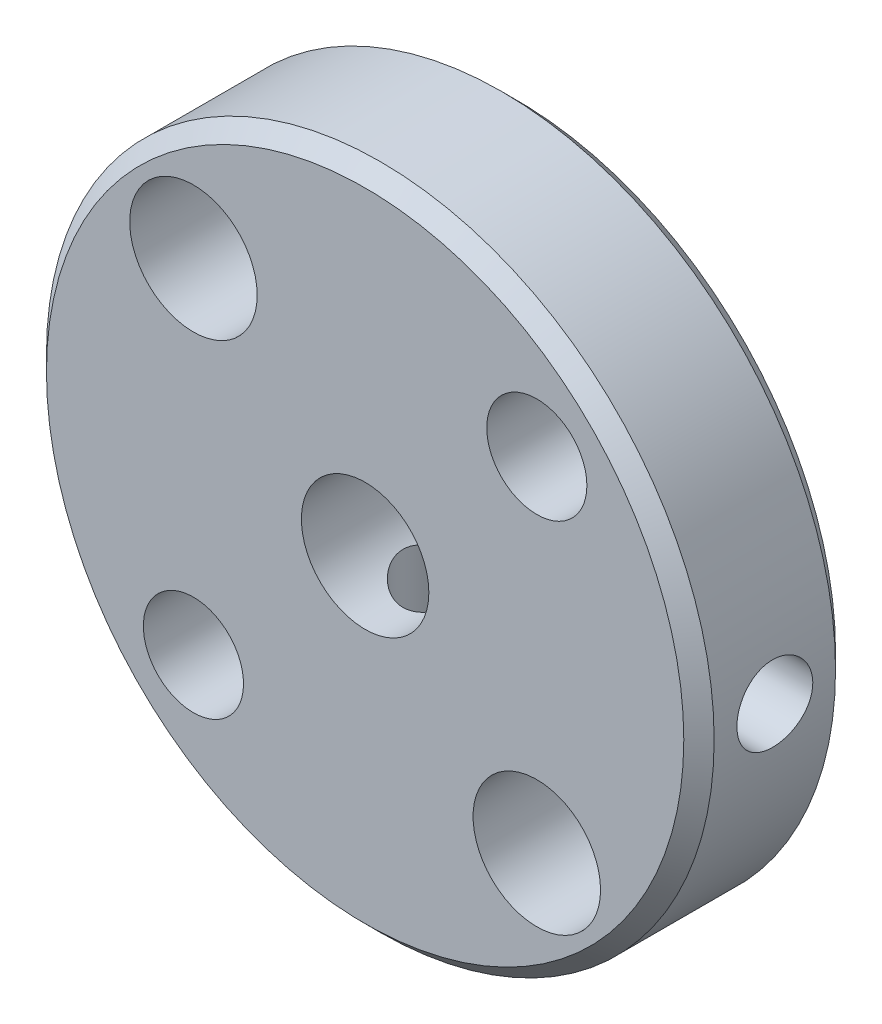
ISO-10303-21;
HEADER;
FILE_DESCRIPTION(('STEP AP214'),'2;1');
FILE_NAME('part.step','',(''),(''),'','','');
FILE_SCHEMA(('AUTOMOTIVE_DESIGN { 1 0 10303 214 1 1 1 1 }'));
ENDSEC;
DATA;
#1=APPLICATION_CONTEXT('core data for automotive mechanical design processes');
#2=APPLICATION_PROTOCOL_DEFINITION('international standard','automotive_design',2000,#1);
#3=PRODUCT_CONTEXT('',#1,'mechanical');
#4=PRODUCT('Part','Part','',(#3));
#5=PRODUCT_RELATED_PRODUCT_CATEGORY('part','',(#4));
#6=PRODUCT_DEFINITION_FORMATION('','',#4);
#7=PRODUCT_DEFINITION_CONTEXT('part definition',#1,'design');
#8=PRODUCT_DEFINITION('design','',#6,#7);
#9=PRODUCT_DEFINITION_SHAPE('','',#8);
#10=(LENGTH_UNIT() NAMED_UNIT(*) SI_UNIT(.MILLI.,.METRE.));
#11=(NAMED_UNIT(*) PLANE_ANGLE_UNIT() SI_UNIT($,.RADIAN.));
#12=(NAMED_UNIT(*) SI_UNIT($,.STERADIAN.) SOLID_ANGLE_UNIT());
#13=UNCERTAINTY_MEASURE_WITH_UNIT(LENGTH_MEASURE(1.E-05),#10,'distance_accuracy_value','');
#14=(GEOMETRIC_REPRESENTATION_CONTEXT(3) GLOBAL_UNCERTAINTY_ASSIGNED_CONTEXT((#13)) GLOBAL_UNIT_ASSIGNED_CONTEXT((#10,
#11,#12)) REPRESENTATION_CONTEXT('',''));
#15=CARTESIAN_POINT('',(0.,0.,0.));
#16=DIRECTION('',(0.,0.,1.));
#17=DIRECTION('',(1.,0.,0.));
#18=AXIS2_PLACEMENT_3D('',#15,#16,#17);
#19=CARTESIAN_POINT('',(0.,0.,4.));
#20=DIRECTION('',(0.,0.,-1.));
#21=DIRECTION('',(-1.,0.,0.));
#22=AXIS2_PLACEMENT_3D('',#19,#20,#21);
#23=CYLINDRICAL_SURFACE('',#22,4.);
#24=CARTESIAN_POINT('',(0.,0.,0.500000000000004));
#25=DIRECTION('',(0.,0.,1.));
#26=DIRECTION('',(1.,0.,0.));
#27=AXIS2_PLACEMENT_3D('',#24,#25,#26);
#28=CIRCLE('',#27,4.);
#29=CARTESIAN_POINT('',(4.,0.,0.500000000000004));
#30=VERTEX_POINT('',#29);
#31=EDGE_CURVE('E39',#30,#30,#28,.T.);
#32=ORIENTED_EDGE('',*,*,#31,.T.);
#33=EDGE_LOOP('',(#32));
#34=FACE_BOUND('',#33,.T.);
#35=CARTESIAN_POINT('',(0.,0.,4.));
#36=DIRECTION('',(0.,0.,1.));
#37=DIRECTION('',(1.,0.,0.));
#38=AXIS2_PLACEMENT_3D('',#35,#36,#37);
#39=CIRCLE('',#38,4.);
#40=CARTESIAN_POINT('',(4.,0.,4.));
#41=VERTEX_POINT('',#40);
#42=EDGE_CURVE('E58',#41,#41,#39,.T.);
#43=ORIENTED_EDGE('',*,*,#42,.F.);
#44=EDGE_LOOP('',(#43));
#45=FACE_BOUND('',#44,.T.);
#46=ADVANCED_FACE('F32',(#34,#45),#23,.T.);
#47=CARTESIAN_POINT('',(0.,0.,0.));
#48=DIRECTION('',(0.,0.,1.));
#49=DIRECTION('',(1.,0.,0.));
#50=AXIS2_PLACEMENT_3D('',#47,#48,#49);
#51=PLANE('',#50);
#52=CARTESIAN_POINT('',(0.,0.,0.));
#53=DIRECTION('',(0.,0.,1.));
#54=DIRECTION('',(1.,0.,0.));
#55=AXIS2_PLACEMENT_3D('',#52,#53,#54);
#56=CIRCLE('',#55,3.5);
#57=CARTESIAN_POINT('',(3.5,0.,0.));
#58=VERTEX_POINT('',#57);
#59=EDGE_CURVE('E10',#58,#58,#56,.F.);
#60=ORIENTED_EDGE('',*,*,#59,.T.);
#61=EDGE_LOOP('',(#60));
#62=FACE_BOUND('',#61,.T.);
#63=CARTESIAN_POINT('',(0.,0.,0.));
#64=DIRECTION('',(0.,0.,1.));
#65=DIRECTION('',(1.,0.,0.));
#66=AXIS2_PLACEMENT_3D('',#63,#64,#65);
#67=CIRCLE('',#66,2.1);
#68=CARTESIAN_POINT('',(2.1,0.,0.));
#69=VERTEX_POINT('',#68);
#70=EDGE_CURVE('E271',#69,#69,#67,.T.);
#71=ORIENTED_EDGE('',*,*,#70,.T.);
#72=EDGE_LOOP('',(#71));
#73=FACE_BOUND('',#72,.T.);
#74=ADVANCED_FACE('F106',(#62,#73),#51,.F.);
#75=CARTESIAN_POINT('',(0.,0.,4.));
#76=DIRECTION('',(0.,0.,1.));
#77=DIRECTION('',(1.,0.,0.));
#78=AXIS2_PLACEMENT_3D('',#75,#76,#77);
#79=PLANE('',#78);
#80=CARTESIAN_POINT('',(0.,0.,4.));
#81=DIRECTION('',(0.,0.,1.));
#82=DIRECTION('',(1.,0.,0.));
#83=AXIS2_PLACEMENT_3D('',#80,#81,#82);
#84=CIRCLE('',#83,10.5);
#85=CARTESIAN_POINT('',(10.5,0.,4.));
#86=VERTEX_POINT('',#85);
#87=EDGE_CURVE('E43',#86,#86,#84,.F.);
#88=ORIENTED_EDGE('',*,*,#87,.T.);
#89=EDGE_LOOP('',(#88));
#90=FACE_BOUND('',#89,.T.);
#91=CARTESIAN_POINT('',(5.65685424949235,5.65685424949241,4.));
#92=DIRECTION('',(0.,0.,1.));
#93=DIRECTION('',(1.,0.,0.));
#94=AXIS2_PLACEMENT_3D('',#91,#92,#93);
#95=CIRCLE('',#94,1.64999999999999);
#96=CARTESIAN_POINT('',(7.30685424949234,5.65685424949241,4.));
#97=VERTEX_POINT('',#96);
#98=EDGE_CURVE('E282',#97,#97,#95,.T.);
#99=ORIENTED_EDGE('',*,*,#98,.T.);
#100=EDGE_LOOP('',(#99));
#101=FACE_BOUND('',#100,.T.);
#102=CARTESIAN_POINT('',(-5.65685424949235,-5.65685424949242,4.));
#103=DIRECTION('',(0.,0.,1.));
#104=DIRECTION('',(1.,0.,0.));
#105=AXIS2_PLACEMENT_3D('',#102,#103,#104);
#106=CIRCLE('',#105,1.64999999999999);
#107=CARTESIAN_POINT('',(-4.00685424949235,-5.65685424949242,4.));
#108=VERTEX_POINT('',#107);
#109=EDGE_CURVE('E275',#108,#108,#106,.T.);
#110=ORIENTED_EDGE('',*,*,#109,.T.);
#111=EDGE_LOOP('',(#110));
#112=FACE_BOUND('',#111,.T.);
#113=CARTESIAN_POINT('',(5.65685424949241,-5.65685424949235,4.));
#114=DIRECTION('',(0.,0.,1.));
#115=DIRECTION('',(1.,0.,0.));
#116=AXIS2_PLACEMENT_3D('',#113,#114,#115);
#117=CIRCLE('',#116,2.1);
#118=CARTESIAN_POINT('',(7.75685424949241,-5.65685424949235,4.));
#119=VERTEX_POINT('',#118);
#120=EDGE_CURVE('E263',#119,#119,#117,.T.);
#121=ORIENTED_EDGE('',*,*,#120,.T.);
#122=EDGE_LOOP('',(#121));
#123=FACE_BOUND('',#122,.T.);
#124=CARTESIAN_POINT('',(-5.65685424949241,5.65685424949235,4.));
#125=DIRECTION('',(0.,0.,1.));
#126=DIRECTION('',(1.,0.,0.));
#127=AXIS2_PLACEMENT_3D('',#124,#125,#126);
#128=CIRCLE('',#127,2.1);
#129=CARTESIAN_POINT('',(-3.55685424949241,5.65685424949235,4.));
#130=VERTEX_POINT('',#129);
#131=EDGE_CURVE('E260',#130,#130,#128,.T.);
#132=ORIENTED_EDGE('',*,*,#131,.T.);
#133=EDGE_LOOP('',(#132));
#134=FACE_BOUND('',#133,.T.);
#135=ORIENTED_EDGE('',*,*,#42,.T.);
#136=EDGE_LOOP('',(#135));
#137=FACE_BOUND('',#136,.T.);
#138=ADVANCED_FACE('F103',(#90,#101,#112,#123,#134,#137),#79,.F.);
#139=CARTESIAN_POINT('',(0.,0.,9.));
#140=DIRECTION('',(0.,0.,-1.));
#141=DIRECTION('',(-1.,0.,0.));
#142=AXIS2_PLACEMENT_3D('',#139,#140,#141);
#143=CYLINDRICAL_SURFACE('',#142,11.);
#144=CARTESIAN_POINT('',(0.,0.,8.5));
#145=DIRECTION('',(0.,0.,1.));
#146=DIRECTION('',(1.,0.,0.));
#147=AXIS2_PLACEMENT_3D('',#144,#145,#146);
#148=CIRCLE('',#147,11.);
#149=CARTESIAN_POINT('',(11.,0.,8.5));
#150=VERTEX_POINT('',#149);
#151=EDGE_CURVE('E47',#150,#150,#148,.F.);
#152=ORIENTED_EDGE('',*,*,#151,.T.);
#153=EDGE_LOOP('',(#152));
#154=FACE_BOUND('',#153,.T.);
#155=CARTESIAN_POINT('',(0.,0.,4.50000000000001));
#156=DIRECTION('',(0.,0.,1.));
#157=DIRECTION('',(1.,0.,0.));
#158=AXIS2_PLACEMENT_3D('',#155,#156,#157);
#159=CIRCLE('',#158,11.);
#160=CARTESIAN_POINT('',(11.,0.,4.50000000000001));
#161=VERTEX_POINT('',#160);
#162=EDGE_CURVE('E52',#161,#161,#159,.T.);
#163=ORIENTED_EDGE('',*,*,#162,.T.);
#164=EDGE_LOOP('',(#163));
#165=FACE_BOUND('',#164,.T.);
#166=CARTESIAN_POINT('',(11.,0.,7.75));
#167=CARTESIAN_POINT('',(10.999999098796,0.0699710602463905,7.74999699818814));
#168=CARTESIAN_POINT('',(10.9993252987046,0.139987069063152,7.74410506509641));
#169=CARTESIAN_POINT('',(10.996702178266,0.278074243505308,7.7206920371657));
#170=CARTESIAN_POINT('',(10.9947514907003,0.346143242753134,7.7031584768452));
#171=CARTESIAN_POINT('',(10.9897945640633,0.478317045301611,7.65698245914168));
#172=CARTESIAN_POINT('',(10.9867890005829,0.542424355017556,7.62834711062706));
#173=CARTESIAN_POINT('',(10.9800574647103,0.664910051163571,7.56079510299002));
#174=CARTESIAN_POINT('',(10.9763316253718,0.72328949268255,7.52188034225789));
#175=CARTESIAN_POINT('',(10.968557071608,0.832943192201809,7.43468294825341));
#176=CARTESIAN_POINT('',(10.9645070990459,0.884187415914031,7.38636265432368));
#177=CARTESIAN_POINT('',(10.9565510031881,0.977857611459238,7.28180649659008));
#178=CARTESIAN_POINT('',(10.9526448868951,1.02028315448394,7.22557024809588));
#179=CARTESIAN_POINT('',(10.9454062056308,1.09522113283396,7.10658651677426));
#180=CARTESIAN_POINT('',(10.9420752550327,1.12770585724163,7.04382147448482));
#181=CARTESIAN_POINT('',(10.9363802408844,1.18166312999786,6.91368303245055));
#182=CARTESIAN_POINT('',(10.9340161468672,1.20313602534935,6.84630977799478));
#183=CARTESIAN_POINT('',(10.9305342775891,1.23436981435038,6.70917683280815));
#184=CARTESIAN_POINT('',(10.9294111476981,1.24418104088523,6.63942874432143));
#185=CARTESIAN_POINT('',(10.928521890078,1.25196865940669,6.49926759216056));
#186=CARTESIAN_POINT('',(10.9287557169125,1.24994544765991,6.42885455083064));
#187=CARTESIAN_POINT('',(10.9305490559729,1.23416301698987,6.2897111909642));
#188=CARTESIAN_POINT('',(10.9321023319257,1.2204590054152,6.22097451875746));
#189=CARTESIAN_POINT('',(10.9363498240334,1.18179000539203,6.08678297309618));
#190=CARTESIAN_POINT('',(10.9390440596154,1.15682482519956,6.02132815554287));
#191=CARTESIAN_POINT('',(10.9452770263127,1.09628205008233,5.89538543961468));
#192=CARTESIAN_POINT('',(10.9488176820281,1.06068022266344,5.83490928933374));
#193=CARTESIAN_POINT('',(10.9563429994385,0.979892129097689,5.72076925155199));
#194=CARTESIAN_POINT('',(10.9603276779232,0.934705500466745,5.66710562181413));
#195=CARTESIAN_POINT('',(10.9683198318057,0.835723376133648,5.56779331897667));
#196=CARTESIAN_POINT('',(10.9723273076041,0.781880249551144,5.52219210498768));
#197=CARTESIAN_POINT('',(10.9798921650149,0.66727820558108,5.44066779872062));
#198=CARTESIAN_POINT('',(10.9834495458722,0.606519276591053,5.40474472267966));
#199=CARTESIAN_POINT('',(10.9897150774973,0.479775541657381,5.34359731749806));
#200=CARTESIAN_POINT('',(10.9924230139116,0.413789421907974,5.318375688256));
#201=CARTESIAN_POINT('',(10.9966825017733,0.278481205096897,5.27938340396215));
#202=CARTESIAN_POINT('',(10.9982340979176,0.209159237088414,5.26561230630247));
#203=CARTESIAN_POINT('',(11.0000003081264,0.0695577812373213,5.24997287847912));
#204=CARTESIAN_POINT('',(11.0002222716223,-0.00071428718994585,5.24803911714425));
#205=CARTESIAN_POINT('',(10.9993239851522,-0.140581487877355,5.25595697581694));
#206=CARTESIAN_POINT('',(10.9982037587135,-0.210176631981711,5.26580838924277));
#207=CARTESIAN_POINT('',(10.994751592849,-0.34652339658548,5.29696262846704));
#208=CARTESIAN_POINT('',(10.9924229265985,-0.413282173840718,5.31823452614039));
#209=CARTESIAN_POINT('',(10.9868148348929,-0.5422843728089,5.37159392721105));
#210=CARTESIAN_POINT('',(10.9835353823457,-0.60452766579224,5.40368173880652));
#211=CARTESIAN_POINT('',(10.9763735736619,-0.723026006046902,5.47792232596807));
#212=CARTESIAN_POINT('',(10.9724886880503,-0.779254179921541,5.52011774715062));
#213=CARTESIAN_POINT('',(10.9645592695384,-0.883853426159737,5.61331505860913));
#214=CARTESIAN_POINT('',(10.9605147314369,-0.932224242281398,5.66431723597664));
#215=CARTESIAN_POINT('',(10.9526994422005,-1.01996547066722,5.77396722356543));
#216=CARTESIAN_POINT('',(10.9489300605485,-1.05929271449868,5.83264968850057));
#217=CARTESIAN_POINT('',(10.942113624429,-1.12753292733445,5.95582498686534));
#218=CARTESIAN_POINT('',(10.9390665576492,-1.15644607385566,6.0203177212307));
#219=CARTESIAN_POINT('',(10.9340487479586,-1.20296631338926,6.15313935058659));
#220=CARTESIAN_POINT('',(10.9320756279092,-1.22059839191761,6.22145940091597));
#221=CARTESIAN_POINT('',(10.9294220488897,-1.24413675347566,6.36011418608627));
#222=CARTESIAN_POINT('',(10.9287415409866,-1.25004348037979,6.43044884456001));
#223=CARTESIAN_POINT('',(10.9287514804399,-1.24995628412513,6.57070705786577));
#224=CARTESIAN_POINT('',(10.9294341158956,-1.24403017260146,6.64063066519323));
#225=CARTESIAN_POINT('',(10.9320766991578,-1.22058843708503,6.77848162141657));
#226=CARTESIAN_POINT('',(10.9340366477847,-1.20307280564941,6.84640896903041));
#227=CARTESIAN_POINT('',(10.9390107260672,-1.15696926667391,6.9783342740526));
#228=CARTESIAN_POINT('',(10.9420246021864,-1.12838402190135,7.0423331721536));
#229=CARTESIAN_POINT('',(10.9487674156768,-1.06095945000957,7.16463624005349));
#230=CARTESIAN_POINT('',(10.9524963558113,-1.02212008326356,7.22294038784396));
#231=CARTESIAN_POINT('',(10.9602747641055,-0.935036488100206,7.33254612900023));
#232=CARTESIAN_POINT('',(10.96432588332,-0.886741677283562,7.3838074186029));
#233=CARTESIAN_POINT('',(10.972277338952,-0.782221793226697,7.47752568809066));
#234=CARTESIAN_POINT('',(10.9761776393339,-0.725994839471947,7.51998057428255));
#235=CARTESIAN_POINT('',(10.9834013412845,-0.607005915440242,7.59499201372946));
#236=CARTESIAN_POINT('',(10.9867228740683,-0.54422378573771,7.62751674875123));
#237=CARTESIAN_POINT('',(10.9923953332668,-0.414088724759976,7.68151706433772));
#238=CARTESIAN_POINT('',(10.9947473329669,-0.346740944451953,7.70300486944508));
#239=CARTESIAN_POINT('',(10.9976371163841,-0.23252369968437,7.7290739614261));
#240=CARTESIAN_POINT('',(10.9985189706332,-0.186379504843341,7.73691021850484));
#241=CARTESIAN_POINT('',(10.9997007118951,-0.09349689521114,7.74737422589619));
#242=CARTESIAN_POINT('',(11.0000006022337,-0.046758483817382,7.75000200597462));
#243=CARTESIAN_POINT('',(11.,0.,7.75));
#244=B_SPLINE_CURVE_WITH_KNOTS('',3,(#166,#167,#168,#169,#170,#171,#172,#173,#174,#175,#176,
#177,#178,#179,#180,#181,#182,#183,#184,#185,#186,#187,#188,#189,#190,#191,#192,#193,#194,#195,
#196,#197,#198,#199,#200,#201,#202,#203,#204,#205,#206,#207,#208,#209,#210,#211,#212,#213,#214,
#215,#216,#217,#218,#219,#220,#221,#222,#223,#224,#225,#226,#227,#228,#229,#230,#231,#232,#233,
#234,#235,#236,#237,#238,#239,#240,#241,#242,#243),.UNSPECIFIED.,.T.,.F.,(4,2,2,2,2,2,2,2,2,2,2,
2,2,2,2,2,2,2,2,2,2,2,2,2,2,2,2,2,2,2,2,2,2,2,2,2,2,2,4),(0.,0.209742411074567,
0.419709770574088,0.629542902006037,0.839337308750923,1.04998970573655,1.26065234329855,
1.47189698188367,1.68313496335365,1.89345787180112,2.10377373779623,2.31310105799441,
2.52243194254448,2.73224341085967,2.94206281537296,3.15307892807649,3.36409539480162,
3.57516506786321,3.78622658187585,3.99612038686368,4.20601051268755,4.41533507552064,
4.62466560353621,4.83489538837651,5.04513202779438,5.25635228791534,5.4675689474421,
5.67831616606275,5.88905540649307,6.09859040856626,6.30812554520447,6.51761030997687,
6.72709588430993,6.9377343421937,7.14842282141904,7.35977947100788,7.57090151365798,
7.71106364850653,7.85122498234265),.UNSPECIFIED.);
#245=CARTESIAN_POINT('',(11.,0.,7.75));
#246=VERTEX_POINT('',#245);
#247=EDGE_CURVE('E67',#246,#246,#244,.T.);
#248=ORIENTED_EDGE('',*,*,#247,.T.);
#249=EDGE_LOOP('',(#248));
#250=FACE_BOUND('',#249,.T.);
#251=CARTESIAN_POINT('',(0.,-11.,7.75));
#252=CARTESIAN_POINT('',(0.069971060246352,-10.999999098796,7.74999699818814));
#253=CARTESIAN_POINT('',(0.139987069063114,-10.9993252987046,7.74410506509641));
#254=CARTESIAN_POINT('',(0.27807424350527,-10.996702178266,7.7206920371657));
#255=CARTESIAN_POINT('',(0.346143242753095,-10.9947514907003,7.7031584768452));
#256=CARTESIAN_POINT('',(0.478317045301572,-10.9897945640633,7.65698245914168));
#257=CARTESIAN_POINT('',(0.542424355017518,-10.9867890005829,7.62834711062706));
#258=CARTESIAN_POINT('',(0.664910051163533,-10.9800574647103,7.56079510299002));
#259=CARTESIAN_POINT('',(0.723289492682511,-10.9763316253718,7.52188034225789));
#260=CARTESIAN_POINT('',(0.832943192201771,-10.968557071608,7.43468294825341));
#261=CARTESIAN_POINT('',(0.884187415913993,-10.9645070990459,7.38636265432368));
#262=CARTESIAN_POINT('',(0.9778576114592,-10.9565510031881,7.28180649659008));
#263=CARTESIAN_POINT('',(1.0202831544839,-10.9526448868951,7.22557024809588));
#264=CARTESIAN_POINT('',(1.09522113283393,-10.9454062056308,7.10658651677426));
#265=CARTESIAN_POINT('',(1.12770585724159,-10.9420752550327,7.04382147448482));
#266=CARTESIAN_POINT('',(1.18166312999782,-10.9363802408844,6.91368303245055));
#267=CARTESIAN_POINT('',(1.20313602534931,-10.9340161468672,6.84630977799478));
#268=CARTESIAN_POINT('',(1.23436981435034,-10.9305342775891,6.70917683280815));
#269=CARTESIAN_POINT('',(1.24418104088519,-10.9294111476981,6.63942874432143));
#270=CARTESIAN_POINT('',(1.25196865940665,-10.928521890078,6.49926759216056));
#271=CARTESIAN_POINT('',(1.24994544765987,-10.9287557169125,6.42885455083064));
#272=CARTESIAN_POINT('',(1.23416301698983,-10.9305490559729,6.2897111909642));
#273=CARTESIAN_POINT('',(1.22045900541516,-10.9321023319257,6.22097451875746));
#274=CARTESIAN_POINT('',(1.18179000539199,-10.9363498240334,6.08678297309618));
#275=CARTESIAN_POINT('',(1.15682482519952,-10.9390440596154,6.02132815554287));
#276=CARTESIAN_POINT('',(1.09628205008229,-10.9452770263127,5.89538543961468));
#277=CARTESIAN_POINT('',(1.0606802226634,-10.9488176820281,5.83490928933374));
#278=CARTESIAN_POINT('',(0.97989212909765,-10.9563429994385,5.72076925155199));
#279=CARTESIAN_POINT('',(0.934705500466707,-10.9603276779232,5.66710562181413));
#280=CARTESIAN_POINT('',(0.83572337613361,-10.9683198318057,5.56779331897667));
#281=CARTESIAN_POINT('',(0.781880249551105,-10.9723273076041,5.52219210498768));
#282=CARTESIAN_POINT('',(0.667278205581041,-10.9798921650149,5.44066779872062));
#283=CARTESIAN_POINT('',(0.606519276591015,-10.9834495458722,5.40474472267966));
#284=CARTESIAN_POINT('',(0.479775541657342,-10.9897150774974,5.34359731749806));
#285=CARTESIAN_POINT('',(0.413789421907936,-10.9924230139116,5.318375688256));
#286=CARTESIAN_POINT('',(0.278481205096859,-10.9966825017733,5.27938340396215));
#287=CARTESIAN_POINT('',(0.209159237088376,-10.9982340979176,5.26561230630247));
#288=CARTESIAN_POINT('',(0.0695577812372829,-11.0000003081264,5.24997287847912));
#289=CARTESIAN_POINT('',(-0.000714287189984217,-11.0002222716223,5.24803911714425));
#290=CARTESIAN_POINT('',(-0.140581487877393,-10.9993239851522,5.25595697581694));
#291=CARTESIAN_POINT('',(-0.210176631981749,-10.9982037587135,5.26580838924277));
#292=CARTESIAN_POINT('',(-0.346523396585519,-10.994751592849,5.29696262846704));
#293=CARTESIAN_POINT('',(-0.413282173840756,-10.9924229265985,5.31823452614039));
#294=CARTESIAN_POINT('',(-0.542284372808938,-10.9868148348929,5.37159392721105));
#295=CARTESIAN_POINT('',(-0.604527665792279,-10.9835353823457,5.40368173880652));
#296=CARTESIAN_POINT('',(-0.723026006046941,-10.9763735736619,5.47792232596807));
#297=CARTESIAN_POINT('',(-0.77925417992158,-10.9724886880503,5.52011774715062));
#298=CARTESIAN_POINT('',(-0.883853426159775,-10.9645592695384,5.61331505860913));
#299=CARTESIAN_POINT('',(-0.932224242281437,-10.9605147314369,5.66431723597664));
#300=CARTESIAN_POINT('',(-1.01996547066726,-10.9526994422005,5.77396722356543));
#301=CARTESIAN_POINT('',(-1.05929271449872,-10.9489300605485,5.83264968850057));
#302=CARTESIAN_POINT('',(-1.12753292733449,-10.942113624429,5.95582498686534));
#303=CARTESIAN_POINT('',(-1.1564460738557,-10.9390665576492,6.0203177212307));
#304=CARTESIAN_POINT('',(-1.20296631338929,-10.9340487479586,6.15313935058659));
#305=CARTESIAN_POINT('',(-1.22059839191765,-10.9320756279092,6.22145940091597));
#306=CARTESIAN_POINT('',(-1.24413675347569,-10.9294220488897,6.36011418608627));
#307=CARTESIAN_POINT('',(-1.25004348037983,-10.9287415409866,6.43044884456001));
#308=CARTESIAN_POINT('',(-1.24995628412517,-10.9287514804399,6.57070705786577));
#309=CARTESIAN_POINT('',(-1.2440301726015,-10.9294341158956,6.64063066519323));
#310=CARTESIAN_POINT('',(-1.22058843708507,-10.9320766991578,6.77848162141657));
#311=CARTESIAN_POINT('',(-1.20307280564944,-10.9340366477846,6.84640896903041));
#312=CARTESIAN_POINT('',(-1.15696926667395,-10.9390107260672,6.9783342740526));
#313=CARTESIAN_POINT('',(-1.12838402190138,-10.9420246021864,7.0423331721536));
#314=CARTESIAN_POINT('',(-1.06095945000961,-10.9487674156768,7.16463624005349));
#315=CARTESIAN_POINT('',(-1.0221200832636,-10.9524963558113,7.22294038784396));
#316=CARTESIAN_POINT('',(-0.935036488100244,-10.9602747641055,7.33254612900023));
#317=CARTESIAN_POINT('',(-0.886741677283601,-10.96432588332,7.3838074186029));
#318=CARTESIAN_POINT('',(-0.782221793226735,-10.972277338952,7.47752568809066));
#319=CARTESIAN_POINT('',(-0.725994839471985,-10.9761776393339,7.51998057428255));
#320=CARTESIAN_POINT('',(-0.60700591544028,-10.9834013412845,7.59499201372946));
#321=CARTESIAN_POINT('',(-0.544223785737749,-10.9867228740683,7.62751674875123));
#322=CARTESIAN_POINT('',(-0.414088724760015,-10.9923953332668,7.68151706433772));
#323=CARTESIAN_POINT('',(-0.346740944451991,-10.9947473329669,7.70300486944508));
#324=CARTESIAN_POINT('',(-0.232523699684408,-10.9976371163841,7.7290739614261));
#325=CARTESIAN_POINT('',(-0.186379504843379,-10.9985189706332,7.73691021850484));
#326=CARTESIAN_POINT('',(-0.0934968952111784,-10.9997007118951,7.74737422589619));
#327=CARTESIAN_POINT('',(-0.0467584838174204,-11.0000006022337,7.75000200597462));
#328=CARTESIAN_POINT('',(0.,-11.,7.75));
#329=B_SPLINE_CURVE_WITH_KNOTS('',3,(#251,#252,#253,#254,#255,#256,#257,#258,#259,#260,#261,
#262,#263,#264,#265,#266,#267,#268,#269,#270,#271,#272,#273,#274,#275,#276,#277,#278,#279,#280,
#281,#282,#283,#284,#285,#286,#287,#288,#289,#290,#291,#292,#293,#294,#295,#296,#297,#298,#299,
#300,#301,#302,#303,#304,#305,#306,#307,#308,#309,#310,#311,#312,#313,#314,#315,#316,#317,#318,
#319,#320,#321,#322,#323,#324,#325,#326,#327,#328),.UNSPECIFIED.,.T.,.F.,(4,2,2,2,2,2,2,2,2,2,2,
2,2,2,2,2,2,2,2,2,2,2,2,2,2,2,2,2,2,2,2,2,2,2,2,2,2,2,4),(0.,0.209742411074567,
0.419709770574088,0.629542902006037,0.839337308750923,1.04998970573655,1.26065234329855,
1.47189698188367,1.68313496335365,1.89345787180112,2.10377373779623,2.31310105799441,
2.52243194254448,2.73224341085967,2.94206281537296,3.15307892807649,3.36409539480162,
3.57516506786321,3.78622658187585,3.99612038686368,4.20601051268755,4.41533507552064,
4.62466560353621,4.83489538837651,5.04513202779438,5.25635228791534,5.4675689474421,
5.67831616606275,5.88905540649307,6.09859040856626,6.30812554520447,6.51761030997687,
6.72709588430993,6.9377343421937,7.14842282141904,7.35977947100788,7.57090151365798,
7.71106364850653,7.85122498234265),.UNSPECIFIED.);
#330=CARTESIAN_POINT('',(0.,-11.,7.75));
#331=VERTEX_POINT('',#330);
#332=EDGE_CURVE('E66',#331,#331,#329,.T.);
#333=ORIENTED_EDGE('',*,*,#332,.T.);
#334=EDGE_LOOP('',(#333));
#335=FACE_BOUND('',#334,.T.);
#336=ADVANCED_FACE('F97',(#154,#165,#250,#335),#143,.T.);
#337=CARTESIAN_POINT('',(0.,0.,9.));
#338=DIRECTION('',(0.,0.,1.));
#339=DIRECTION('',(1.,0.,0.));
#340=AXIS2_PLACEMENT_3D('',#337,#338,#339);
#341=PLANE('',#340);
#342=CARTESIAN_POINT('',(0.,0.,9.));
#343=DIRECTION('',(0.,0.,1.));
#344=DIRECTION('',(1.,0.,0.));
#345=AXIS2_PLACEMENT_3D('',#342,#343,#344);
#346=CIRCLE('',#345,10.5);
#347=CARTESIAN_POINT('',(10.5,0.,9.));
#348=VERTEX_POINT('',#347);
#349=EDGE_CURVE('E55',#348,#348,#346,.T.);
#350=ORIENTED_EDGE('',*,*,#349,.T.);
#351=EDGE_LOOP('',(#350));
#352=FACE_BOUND('',#351,.T.);
#353=CARTESIAN_POINT('',(5.65685424949235,5.65685424949241,9.));
#354=DIRECTION('',(0.,0.,1.));
#355=DIRECTION('',(1.,0.,0.));
#356=AXIS2_PLACEMENT_3D('',#353,#354,#355);
#357=CIRCLE('',#356,1.64999999999999);
#358=CARTESIAN_POINT('',(7.30685424949234,5.65685424949241,9.));
#359=VERTEX_POINT('',#358);
#360=EDGE_CURVE('E91',#359,#359,#357,.T.);
#361=ORIENTED_EDGE('',*,*,#360,.F.);
#362=EDGE_LOOP('',(#361));
#363=FACE_BOUND('',#362,.T.);
#364=CARTESIAN_POINT('',(-5.65685424949235,-5.65685424949242,9.));
#365=DIRECTION('',(0.,0.,1.));
#366=DIRECTION('',(1.,0.,0.));
#367=AXIS2_PLACEMENT_3D('',#364,#365,#366);
#368=CIRCLE('',#367,1.64999999999999);
#369=CARTESIAN_POINT('',(-4.00685424949236,-5.65685424949242,9.));
#370=VERTEX_POINT('',#369);
#371=EDGE_CURVE('E280',#370,#370,#368,.T.);
#372=ORIENTED_EDGE('',*,*,#371,.F.);
#373=EDGE_LOOP('',(#372));
#374=FACE_BOUND('',#373,.T.);
#375=CARTESIAN_POINT('',(0.,0.,9.));
#376=DIRECTION('',(0.,0.,1.));
#377=DIRECTION('',(1.,0.,0.));
#378=AXIS2_PLACEMENT_3D('',#375,#376,#377);
#379=CIRCLE('',#378,2.1);
#380=CARTESIAN_POINT('',(2.1,0.,9.));
#381=VERTEX_POINT('',#380);
#382=EDGE_CURVE('E272',#381,#381,#379,.T.);
#383=ORIENTED_EDGE('',*,*,#382,.F.);
#384=EDGE_LOOP('',(#383));
#385=FACE_BOUND('',#384,.T.);
#386=CARTESIAN_POINT('',(5.65685424949241,-5.65685424949235,9.));
#387=DIRECTION('',(0.,0.,1.));
#388=DIRECTION('',(1.,0.,0.));
#389=AXIS2_PLACEMENT_3D('',#386,#387,#388);
#390=CIRCLE('',#389,2.1);
#391=CARTESIAN_POINT('',(7.75685424949241,-5.65685424949235,9.));
#392=VERTEX_POINT('',#391);
#393=EDGE_CURVE('E268',#392,#392,#390,.T.);
#394=ORIENTED_EDGE('',*,*,#393,.F.);
#395=EDGE_LOOP('',(#394));
#396=FACE_BOUND('',#395,.T.);
#397=CARTESIAN_POINT('',(-5.65685424949241,5.65685424949235,9.));
#398=DIRECTION('',(0.,0.,1.));
#399=DIRECTION('',(1.,0.,0.));
#400=AXIS2_PLACEMENT_3D('',#397,#398,#399);
#401=CIRCLE('',#400,2.1);
#402=CARTESIAN_POINT('',(-3.55685424949241,5.65685424949235,9.));
#403=VERTEX_POINT('',#402);
#404=EDGE_CURVE('E257',#403,#403,#401,.T.);
#405=ORIENTED_EDGE('',*,*,#404,.F.);
#406=EDGE_LOOP('',(#405));
#407=FACE_BOUND('',#406,.T.);
#408=ADVANCED_FACE('F102',(#352,#363,#374,#385,#396,#407),#341,.T.);
#409=CARTESIAN_POINT('',(-5.65685424949241,5.65685424949235,0.));
#410=DIRECTION('',(0.,0.,1.));
#411=DIRECTION('',(1.,0.,0.));
#412=AXIS2_PLACEMENT_3D('',#409,#410,#411);
#413=CYLINDRICAL_SURFACE('',#412,2.1);
#414=ORIENTED_EDGE('',*,*,#404,.T.);
#415=EDGE_LOOP('',(#414));
#416=FACE_BOUND('',#415,.T.);
#417=ORIENTED_EDGE('',*,*,#131,.F.);
#418=EDGE_LOOP('',(#417));
#419=FACE_BOUND('',#418,.T.);
#420=ADVANCED_FACE('F172',(#416,#419),#413,.F.);
#421=CARTESIAN_POINT('',(5.65685424949241,-5.65685424949235,0.));
#422=DIRECTION('',(0.,0.,1.));
#423=DIRECTION('',(1.,0.,0.));
#424=AXIS2_PLACEMENT_3D('',#421,#422,#423);
#425=CYLINDRICAL_SURFACE('',#424,2.1);
#426=ORIENTED_EDGE('',*,*,#393,.T.);
#427=EDGE_LOOP('',(#426));
#428=FACE_BOUND('',#427,.T.);
#429=ORIENTED_EDGE('',*,*,#120,.F.);
#430=EDGE_LOOP('',(#429));
#431=FACE_BOUND('',#430,.T.);
#432=ADVANCED_FACE('F214',(#428,#431),#425,.F.);
#433=CARTESIAN_POINT('',(0.,0.,0.));
#434=DIRECTION('',(0.,0.,1.));
#435=DIRECTION('',(1.,0.,0.));
#436=AXIS2_PLACEMENT_3D('',#433,#434,#435);
#437=CYLINDRICAL_SURFACE('',#436,2.1);
#438=CARTESIAN_POINT('',(2.1,0.,7.75));
#439=CARTESIAN_POINT('',(2.0999971621291,-0.0640226775460139,7.74999688604095));
#440=CARTESIAN_POINT('',(2.09704010748215,-0.128152585956528,7.74504670673764));
#441=CARTESIAN_POINT('',(2.08549318076383,-0.254490052465569,7.72549669407343));
#442=CARTESIAN_POINT('',(2.07688886081917,-0.316692250134415,7.71087210910711));
#443=CARTESIAN_POINT('',(2.05491948806018,-0.437071541174805,7.67278899216858));
#444=CARTESIAN_POINT('',(2.04157803425589,-0.495266909771818,7.64937421779307));
#445=CARTESIAN_POINT('',(2.01127508514269,-0.606722922250688,7.59464414389886));
#446=CARTESIAN_POINT('',(1.99431458574446,-0.659984917956784,7.56333101746527));
#447=CARTESIAN_POINT('',(1.95669521688118,-0.764633596048423,7.4910505974036));
#448=CARTESIAN_POINT('',(1.93585346459021,-0.815572146928477,7.44953145232071));
#449=CARTESIAN_POINT('',(1.89320764923087,-0.910200434935883,7.35925516030214));
#450=CARTESIAN_POINT('',(1.87140238962514,-0.953880818837079,7.3104888251701));
#451=CARTESIAN_POINT('',(1.82618251379142,-1.03807660067335,7.20019581401617));
#452=CARTESIAN_POINT('',(1.80288962715745,-1.07757997860756,7.13783988565906));
#453=CARTESIAN_POINT('',(1.76058953983857,-1.14539465089145,7.00600619630544));
#454=CARTESIAN_POINT('',(1.74157547020439,-1.17372393928512,6.93654011417754));
#455=CARTESIAN_POINT('',(1.71473066078549,-1.21248373271032,6.8093388305415));
#456=CARTESIAN_POINT('',(1.70531511442093,-1.22556989258969,6.75274858985345));
#457=CARTESIAN_POINT('',(1.69210107261266,-1.24375455742579,6.63768294266833));
#458=CARTESIAN_POINT('',(1.68829576397353,-1.24886275144711,6.57920991104747));
#459=CARTESIAN_POINT('',(1.68686250841609,-1.25079855338486,6.46194071082016));
#460=CARTESIAN_POINT('',(1.68924600163593,-1.24761082608098,6.40314414455156));
#461=CARTESIAN_POINT('',(1.69984796582053,-1.2331233542355,6.28708507933644));
#462=CARTESIAN_POINT('',(1.70807076540284,-1.22181759180895,6.22982375114378));
#463=CARTESIAN_POINT('',(1.72910246193482,-1.19186017575499,6.11890060925126));
#464=CARTESIAN_POINT('',(1.74185873198025,-1.1732925825183,6.0652055517297));
#465=CARTESIAN_POINT('',(1.77057784152447,-1.12948602608814,5.96154695520805));
#466=CARTESIAN_POINT('',(1.78654186476551,-1.10424459899153,5.91158480310938));
#467=CARTESIAN_POINT('',(1.8232062705075,-1.04278816280288,5.80765672155948));
#468=CARTESIAN_POINT('',(1.84424868470571,-1.00543141633341,5.7544861537548));
#469=CARTESIAN_POINT('',(1.88682783482907,-0.923057115288971,5.65462353206541));
#470=CARTESIAN_POINT('',(1.90836501880793,-0.878032359435053,5.60793764367753));
#471=CARTESIAN_POINT('',(1.95293116109967,-0.774372380969878,5.51599353269503));
#472=CARTESIAN_POINT('',(1.97576967296533,-0.714720551206721,5.47177669012787));
#473=CARTESIAN_POINT('',(2.01726996029285,-0.58744476042849,5.39412736253287));
#474=CARTESIAN_POINT('',(2.03593405287387,-0.519825254065012,5.36068889012186));
#475=CARTESIAN_POINT('',(2.06590582105561,-0.382910433337661,5.30798262291892));
#476=CARTESIAN_POINT('',(2.0776096407174,-0.314003059026024,5.28794132114503));
#477=CARTESIAN_POINT('',(2.09406064688739,-0.172994947727028,5.25995081492141));
#478=CARTESIAN_POINT('',(2.09881591181968,-0.100898019608298,5.25198756805544));
#479=CARTESIAN_POINT('',(2.10066187521826,0.0340010594324126,5.24888957485223));
#480=CARTESIAN_POINT('',(2.09869010708976,0.0967605901060309,5.25218571429739));
#481=CARTESIAN_POINT('',(2.0892971447952,0.220670943201993,5.26804872787285));
#482=CARTESIAN_POINT('',(2.0818760212691,0.281821786467097,5.28061548182824));
#483=CARTESIAN_POINT('',(2.06248590052885,0.399548676454902,5.31402884821051));
#484=CARTESIAN_POINT('',(2.05061940361192,0.456195325667365,5.33468929586215));
#485=CARTESIAN_POINT('',(2.02328795280575,0.565214901961366,5.38348662059433));
#486=CARTESIAN_POINT('',(2.00782226531477,0.6175869548338,5.4116250220282));
#487=CARTESIAN_POINT('',(1.97266903715224,0.722457373172464,5.47784919994779));
#488=CARTESIAN_POINT('',(1.95270968430037,0.774402244062648,5.51666522501221));
#489=CARTESIAN_POINT('',(1.91138294059351,0.871437420579431,5.60152399500534));
#490=CARTESIAN_POINT('',(1.89001392465818,0.916519609641957,5.64757516826184));
#491=CARTESIAN_POINT('',(1.84494563049028,1.00444659551977,5.75243845312637));
#492=CARTESIAN_POINT('',(1.8212959596932,1.04627618436864,5.81212874580764));
#493=CARTESIAN_POINT('',(1.77734140104422,1.11932053409307,5.93879524249638));
#494=CARTESIAN_POINT('',(1.75703281293633,1.1505470792169,6.00576324799749));
#495=CARTESIAN_POINT('',(1.72661507782045,1.19556431362433,6.13051221645744));
#496=CARTESIAN_POINT('',(1.71525017371525,1.21166478294704,6.18715041099507));
#497=CARTESIAN_POINT('',(1.69796630634197,1.23577331547184,6.30290176900339));
#498=CARTESIAN_POINT('',(1.69204000865982,1.24379227869637,6.36201148653542));
#499=CARTESIAN_POINT('',(1.68650352972723,1.25129160369951,6.48128353714004));
#500=CARTESIAN_POINT('',(1.68691504048417,1.25074264050423,6.54144878098638));
#501=CARTESIAN_POINT('',(1.69404215872104,1.24106963437793,6.66071845364892));
#502=CARTESIAN_POINT('',(1.70076134401336,1.23194072476265,6.71982226100972));
#503=CARTESIAN_POINT('',(1.71909460020772,1.20621151721752,6.8328254604925));
#504=CARTESIAN_POINT('',(1.73048807264549,1.18994589011906,6.88683929782776));
#505=CARTESIAN_POINT('',(1.75682627473565,1.15070330311898,6.99143250347804));
#506=CARTESIAN_POINT('',(1.77177233650402,1.12772382497916,7.0420105743129));
#507=CARTESIAN_POINT('',(1.80633627608319,1.07163065871196,7.14664933877111));
#508=CARTESIAN_POINT('',(1.82631917037502,1.03750044859815,7.20004353206803));
#509=CARTESIAN_POINT('',(1.86729082710308,0.961810730750848,7.30087445880068));
#510=CARTESIAN_POINT('',(1.88828040006965,0.920245160345243,7.34830627646634));
#511=CARTESIAN_POINT('',(1.93277497696981,0.823198229533284,7.4434810767948));
#512=CARTESIAN_POINT('',(1.9561591024339,0.766556979818712,7.49010939052115));
#513=CARTESIAN_POINT('',(1.99952280164544,0.645031020347071,7.57324208542061));
#514=CARTESIAN_POINT('',(2.01950129069582,0.580143695653745,7.60974324340349));
#515=CARTESIAN_POINT('',(2.05319694878141,0.446080134934905,7.66992159869308));
#516=CARTESIAN_POINT('',(2.06711263703509,0.377140547150748,7.69401104733383));
#517=CARTESIAN_POINT('',(2.08800134577756,0.235254827997588,7.72982313958579));
#518=CARTESIAN_POINT('',(2.09500075428707,0.162325054106684,7.7415927977793));
#519=CARTESIAN_POINT('',(2.09874418454867,0.0741347523455937,7.74788882119468));
#520=CARTESIAN_POINT('',(2.09921430803036,0.059324626022796,7.74867961890099));
#521=CARTESIAN_POINT('',(2.0998425488409,0.0296782545394262,7.74973557622602));
#522=CARTESIAN_POINT('',(2.10000065788727,0.0148420086959691,7.7500007218912));
#523=CARTESIAN_POINT('',(2.1,0.,7.75));
#524=B_SPLINE_CURVE_WITH_KNOTS('',3,(#438,#439,#440,#441,#442,#443,#444,#445,#446,#447,#448,
#449,#450,#451,#452,#453,#454,#455,#456,#457,#458,#459,#460,#461,#462,#463,#464,#465,#466,#467,
#468,#469,#470,#471,#472,#473,#474,#475,#476,#477,#478,#479,#480,#481,#482,#483,#484,#485,#486,
#487,#488,#489,#490,#491,#492,#493,#494,#495,#496,#497,#498,#499,#500,#501,#502,#503,#504,#505,
#506,#507,#508,#509,#510,#511,#512,#513,#514,#515,#516,#517,#518,#519,#520,#521,#522,#523),
.UNSPECIFIED.,.T.,.F.,(4,2,2,2,2,2,2,2,2,2,2,2,2,2,2,2,2,2,2,2,2,2,2,2,2,2,2,2,2,2,2,2,2,2,2,2,
2,2,2,2,2,2,4),(0.,0.192004033488352,0.384501211905478,0.576052578501204,0.767551300666373,
0.973564827280629,1.17984180795211,1.41092071869248,1.64162598039172,1.8174009735144,
1.99296232530017,2.16884843709784,2.34486506774135,2.51890178389484,2.69300284234917,
2.89712747677768,3.10144487924791,3.33331300711942,3.56505210941058,3.78187668667183,
3.99844898148909,4.18614059402243,4.37382977355366,4.55743388548489,4.74107545318402,
4.94381872781187,5.14679995649728,5.37561800173832,5.60418089922928,5.78334284825227,
5.96226282586766,6.14179531701274,6.32142970338497,6.49341552132849,6.66546593088815,
6.86405919941863,7.06281514197708,7.29269900285767,7.52265594562413,7.74438189628257,
7.96525858040515,8.00976858842738,8.05427977796089),.UNSPECIFIED.);
#525=CARTESIAN_POINT('',(2.1,0.,7.75));
#526=VERTEX_POINT('',#525);
#527=EDGE_CURVE('E132',#526,#526,#524,.T.);
#528=ORIENTED_EDGE('',*,*,#527,.T.);
#529=EDGE_LOOP('',(#528));
#530=FACE_BOUND('',#529,.T.);
#531=CARTESIAN_POINT('',(0.,-2.1,7.75));
#532=CARTESIAN_POINT('',(-0.0640226775460212,-2.0999971621291,7.74999688604095));
#533=CARTESIAN_POINT('',(-0.128152585956535,-2.09704010748215,7.74504670673764));
#534=CARTESIAN_POINT('',(-0.254490052465576,-2.08549318076383,7.72549669407343));
#535=CARTESIAN_POINT('',(-0.316692250134422,-2.07688886081917,7.71087210910711));
#536=CARTESIAN_POINT('',(-0.437071541174812,-2.05491948806018,7.67278899216858));
#537=CARTESIAN_POINT('',(-0.495266909771825,-2.04157803425589,7.64937421779307));
#538=CARTESIAN_POINT('',(-0.606722922250695,-2.01127508514269,7.59464414389886));
#539=CARTESIAN_POINT('',(-0.659984917956791,-1.99431458574446,7.56333101746527));
#540=CARTESIAN_POINT('',(-0.76463359604843,-1.95669521688118,7.4910505974036));
#541=CARTESIAN_POINT('',(-0.815572146928483,-1.93585346459021,7.44953145232071));
#542=CARTESIAN_POINT('',(-0.91020043493589,-1.89320764923087,7.35925516030214));
#543=CARTESIAN_POINT('',(-0.953880818837085,-1.87140238962514,7.3104888251701));
#544=CARTESIAN_POINT('',(-1.03807660067336,-1.82618251379141,7.20019581401617));
#545=CARTESIAN_POINT('',(-1.07757997860757,-1.80288962715745,7.13783988565906));
#546=CARTESIAN_POINT('',(-1.14539465089145,-1.76058953983856,7.00600619630544));
#547=CARTESIAN_POINT('',(-1.17372393928513,-1.74157547020438,6.93654011417754));
#548=CARTESIAN_POINT('',(-1.21248373271033,-1.71473066078549,6.8093388305415));
#549=CARTESIAN_POINT('',(-1.22556989258969,-1.70531511442092,6.75274858985345));
#550=CARTESIAN_POINT('',(-1.2437545574258,-1.69210107261266,6.63768294266833));
#551=CARTESIAN_POINT('',(-1.24886275144712,-1.68829576397353,6.57920991104747));
#552=CARTESIAN_POINT('',(-1.25079855338487,-1.68686250841609,6.46194071082016));
#553=CARTESIAN_POINT('',(-1.24761082608099,-1.68924600163593,6.40314414455156));
#554=CARTESIAN_POINT('',(-1.23312335423551,-1.69984796582052,6.28708507933644));
#555=CARTESIAN_POINT('',(-1.22181759180896,-1.70807076540283,6.22982375114378));
#556=CARTESIAN_POINT('',(-1.191860175755,-1.72910246193482,6.11890060925126));
#557=CARTESIAN_POINT('',(-1.1732925825183,-1.74185873198025,6.0652055517297));
#558=CARTESIAN_POINT('',(-1.12948602608815,-1.77057784152447,5.96154695520805));
#559=CARTESIAN_POINT('',(-1.10424459899154,-1.78654186476551,5.91158480310938));
#560=CARTESIAN_POINT('',(-1.04278816280288,-1.8232062705075,5.80765672155948));
#561=CARTESIAN_POINT('',(-1.00543141633342,-1.84424868470571,5.7544861537548));
#562=CARTESIAN_POINT('',(-0.923057115288978,-1.88682783482906,5.65462353206541));
#563=CARTESIAN_POINT('',(-0.87803235943506,-1.90836501880793,5.60793764367753));
#564=CARTESIAN_POINT('',(-0.774372380969884,-1.95293116109966,5.51599353269503));
#565=CARTESIAN_POINT('',(-0.714720551206728,-1.97576967296533,5.47177669012787));
#566=CARTESIAN_POINT('',(-0.587444760428497,-2.01726996029285,5.39412736253287));
#567=CARTESIAN_POINT('',(-0.519825254065019,-2.03593405287387,5.36068889012186));
#568=CARTESIAN_POINT('',(-0.382910433337668,-2.06590582105561,5.30798262291892));
#569=CARTESIAN_POINT('',(-0.314003059026031,-2.0776096407174,5.28794132114503));
#570=CARTESIAN_POINT('',(-0.172994947727036,-2.09406064688739,5.25995081492141));
#571=CARTESIAN_POINT('',(-0.100898019608305,-2.09881591181968,5.25198756805544));
#572=CARTESIAN_POINT('',(0.0340010594324052,-2.10066187521826,5.24888957485223));
#573=CARTESIAN_POINT('',(0.0967605901060235,-2.09869010708976,5.25218571429739));
#574=CARTESIAN_POINT('',(0.220670943201986,-2.0892971447952,5.26804872787285));
#575=CARTESIAN_POINT('',(0.28182178646709,-2.0818760212691,5.28061548182824));
#576=CARTESIAN_POINT('',(0.399548676454895,-2.06248590052886,5.31402884821051));
#577=CARTESIAN_POINT('',(0.456195325667357,-2.05061940361192,5.33468929586215));
#578=CARTESIAN_POINT('',(0.565214901961359,-2.02328795280575,5.38348662059433));
#579=CARTESIAN_POINT('',(0.617586954833793,-2.00782226531478,5.4116250220282));
#580=CARTESIAN_POINT('',(0.722457373172457,-1.97266903715224,5.47784919994779));
#581=CARTESIAN_POINT('',(0.774402244062641,-1.95270968430037,5.51666522501221));
#582=CARTESIAN_POINT('',(0.871437420579424,-1.91138294059351,5.60152399500534));
#583=CARTESIAN_POINT('',(0.916519609641951,-1.89001392465819,5.64757516826184));
#584=CARTESIAN_POINT('',(1.00444659551976,-1.84494563049028,5.75243845312637));
#585=CARTESIAN_POINT('',(1.04627618436864,-1.82129595969321,5.81212874580764));
#586=CARTESIAN_POINT('',(1.11932053409307,-1.77734140104423,5.93879524249638));
#587=CARTESIAN_POINT('',(1.1505470792169,-1.75703281293633,6.00576324799749));
#588=CARTESIAN_POINT('',(1.19556431362432,-1.72661507782045,6.13051221645744));
#589=CARTESIAN_POINT('',(1.21166478294703,-1.71525017371526,6.18715041099507));
#590=CARTESIAN_POINT('',(1.23577331547183,-1.69796630634197,6.30290176900339));
#591=CARTESIAN_POINT('',(1.24379227869636,-1.69204000865983,6.36201148653542));
#592=CARTESIAN_POINT('',(1.2512916036995,-1.68650352972724,6.48128353714004));
#593=CARTESIAN_POINT('',(1.25074264050422,-1.68691504048418,6.54144878098638));
#594=CARTESIAN_POINT('',(1.24106963437792,-1.69404215872105,6.66071845364892));
#595=CARTESIAN_POINT('',(1.23194072476264,-1.70076134401336,6.71982226100972));
#596=CARTESIAN_POINT('',(1.20621151721752,-1.71909460020772,6.8328254604925));
#597=CARTESIAN_POINT('',(1.18994589011906,-1.7304880726455,6.88683929782776));
#598=CARTESIAN_POINT('',(1.15070330311898,-1.75682627473565,6.99143250347804));
#599=CARTESIAN_POINT('',(1.12772382497915,-1.77177233650402,7.0420105743129));
#600=CARTESIAN_POINT('',(1.07163065871195,-1.8063362760832,7.14664933877111));
#601=CARTESIAN_POINT('',(1.03750044859815,-1.82631917037503,7.20004353206803));
#602=CARTESIAN_POINT('',(0.961810730750841,-1.86729082710308,7.30087445880068));
#603=CARTESIAN_POINT('',(0.920245160345237,-1.88828040006966,7.34830627646634));
#604=CARTESIAN_POINT('',(0.823198229533278,-1.93277497696981,7.4434810767948));
#605=CARTESIAN_POINT('',(0.766556979818706,-1.9561591024339,7.49010939052115));
#606=CARTESIAN_POINT('',(0.645031020347064,-1.99952280164545,7.57324208542061));
#607=CARTESIAN_POINT('',(0.580143695653738,-2.01950129069582,7.60974324340349));
#608=CARTESIAN_POINT('',(0.446080134934898,-2.05319694878141,7.66992159869308));
#609=CARTESIAN_POINT('',(0.377140547150741,-2.06711263703509,7.69401104733383));
#610=CARTESIAN_POINT('',(0.235254827997581,-2.08800134577756,7.72982313958579));
#611=CARTESIAN_POINT('',(0.162325054106676,-2.09500075428707,7.7415927977793));
#612=CARTESIAN_POINT('',(0.0741347523455863,-2.09874418454867,7.74788882119468));
#613=CARTESIAN_POINT('',(0.0593246260227887,-2.09921430803036,7.74867961890099));
#614=CARTESIAN_POINT('',(0.0296782545394188,-2.0998425488409,7.74973557622602));
#615=CARTESIAN_POINT('',(0.0148420086959618,-2.10000065788727,7.7500007218912));
#616=CARTESIAN_POINT('',(0.,-2.1,7.75));
#617=B_SPLINE_CURVE_WITH_KNOTS('',3,(#531,#532,#533,#534,#535,#536,#537,#538,#539,#540,#541,
#542,#543,#544,#545,#546,#547,#548,#549,#550,#551,#552,#553,#554,#555,#556,#557,#558,#559,#560,
#561,#562,#563,#564,#565,#566,#567,#568,#569,#570,#571,#572,#573,#574,#575,#576,#577,#578,#579,
#580,#581,#582,#583,#584,#585,#586,#587,#588,#589,#590,#591,#592,#593,#594,#595,#596,#597,#598,
#599,#600,#601,#602,#603,#604,#605,#606,#607,#608,#609,#610,#611,#612,#613,#614,#615,#616),
.UNSPECIFIED.,.T.,.F.,(4,2,2,2,2,2,2,2,2,2,2,2,2,2,2,2,2,2,2,2,2,2,2,2,2,2,2,2,2,2,2,2,2,2,2,2,
2,2,2,2,2,2,4),(0.,0.192004033488352,0.384501211905478,0.576052578501204,0.767551300666374,
0.973564827280629,1.17984180795211,1.41092071869248,1.64162598039172,1.8174009735144,
1.99296232530017,2.16884843709784,2.34486506774135,2.51890178389484,2.69300284234917,
2.89712747677768,3.10144487924791,3.33331300711942,3.56505210941058,3.78187668667183,
3.99844898148909,4.18614059402243,4.37382977355366,4.55743388548488,4.74107545318402,
4.94381872781187,5.14679995649728,5.37561800173832,5.60418089922928,5.78334284825227,
5.96226282586766,6.14179531701274,6.32142970338497,6.49341552132849,6.66546593088815,
6.86405919941863,7.06281514197708,7.29269900285767,7.52265594562413,7.74438189628257,
7.96525858040515,8.00976858842738,8.05427977796089),.UNSPECIFIED.);
#618=CARTESIAN_POINT('',(0.,-2.1,7.75));
#619=VERTEX_POINT('',#618);
#620=EDGE_CURVE('E59',#619,#619,#617,.T.);
#621=ORIENTED_EDGE('',*,*,#620,.T.);
#622=EDGE_LOOP('',(#621));
#623=FACE_BOUND('',#622,.T.);
#624=ORIENTED_EDGE('',*,*,#70,.F.);
#625=EDGE_LOOP('',(#624));
#626=FACE_BOUND('',#625,.T.);
#627=ORIENTED_EDGE('',*,*,#382,.T.);
#628=EDGE_LOOP('',(#627));
#629=FACE_BOUND('',#628,.T.);
#630=ADVANCED_FACE('F69',(#530,#623,#626,#629),#437,.F.);
#631=CARTESIAN_POINT('',(-5.65685424949235,-5.65685424949242,9.));
#632=DIRECTION('',(0.,0.,1.));
#633=DIRECTION('',(1.,0.,0.));
#634=AXIS2_PLACEMENT_3D('',#631,#632,#633);
#635=CYLINDRICAL_SURFACE('',#634,1.64999999999999);
#636=ORIENTED_EDGE('',*,*,#371,.T.);
#637=EDGE_LOOP('',(#636));
#638=FACE_BOUND('',#637,.T.);
#639=ORIENTED_EDGE('',*,*,#109,.F.);
#640=EDGE_LOOP('',(#639));
#641=FACE_BOUND('',#640,.T.);
#642=ADVANCED_FACE('F213',(#638,#641),#635,.F.);
#643=CARTESIAN_POINT('',(5.65685424949235,5.65685424949241,9.));
#644=DIRECTION('',(0.,0.,1.));
#645=DIRECTION('',(1.,0.,0.));
#646=AXIS2_PLACEMENT_3D('',#643,#644,#645);
#647=CYLINDRICAL_SURFACE('',#646,1.64999999999999);
#648=ORIENTED_EDGE('',*,*,#360,.T.);
#649=EDGE_LOOP('',(#648));
#650=FACE_BOUND('',#649,.T.);
#651=ORIENTED_EDGE('',*,*,#98,.F.);
#652=EDGE_LOOP('',(#651));
#653=FACE_BOUND('',#652,.T.);
#654=ADVANCED_FACE('F79',(#650,#653),#647,.F.);
#655=CARTESIAN_POINT('',(0.,-11.,6.5));
#656=DIRECTION('',(0.,1.,0.));
#657=DIRECTION('',(0.,0.,1.));
#658=AXIS2_PLACEMENT_3D('',#655,#656,#657);
#659=CYLINDRICAL_SURFACE('',#658,1.25);
#660=ORIENTED_EDGE('',*,*,#620,.F.);
#661=EDGE_LOOP('',(#660));
#662=FACE_BOUND('',#661,.T.);
#663=ORIENTED_EDGE('',*,*,#332,.F.);
#664=EDGE_LOOP('',(#663));
#665=FACE_BOUND('',#664,.T.);
#666=ADVANCED_FACE('F73',(#662,#665),#659,.F.);
#667=CARTESIAN_POINT('',(11.,0.,6.5));
#668=DIRECTION('',(-1.,0.,0.));
#669=DIRECTION('',(0.,0.,1.));
#670=AXIS2_PLACEMENT_3D('',#667,#668,#669);
#671=CYLINDRICAL_SURFACE('',#670,1.25);
#672=ORIENTED_EDGE('',*,*,#527,.F.);
#673=EDGE_LOOP('',(#672));
#674=FACE_BOUND('',#673,.T.);
#675=ORIENTED_EDGE('',*,*,#247,.F.);
#676=EDGE_LOOP('',(#675));
#677=FACE_BOUND('',#676,.T.);
#678=ADVANCED_FACE('F78',(#674,#677),#671,.F.);
#679=CARTESIAN_POINT('',(0.,0.,9.));
#680=DIRECTION('',(0.,0.,-1.));
#681=DIRECTION('',(-1.,0.,0.));
#682=AXIS2_PLACEMENT_3D('',#679,#680,#681);
#683=CONICAL_SURFACE('',#682,10.5,0.785398163397445);
#684=ORIENTED_EDGE('',*,*,#151,.F.);
#685=EDGE_LOOP('',(#684));
#686=FACE_BOUND('',#685,.T.);
#687=ORIENTED_EDGE('',*,*,#349,.F.);
#688=EDGE_LOOP('',(#687));
#689=FACE_BOUND('',#688,.T.);
#690=ADVANCED_FACE('F111',(#686,#689),#683,.T.);
#691=CARTESIAN_POINT('',(0.,0.,4.50000000000001));
#692=DIRECTION('',(0.,0.,1.));
#693=DIRECTION('',(1.,0.,0.));
#694=AXIS2_PLACEMENT_3D('',#691,#692,#693);
#695=CONICAL_SURFACE('',#694,11.,0.78539816339745);
#696=ORIENTED_EDGE('',*,*,#87,.F.);
#697=EDGE_LOOP('',(#696));
#698=FACE_BOUND('',#697,.T.);
#699=ORIENTED_EDGE('',*,*,#162,.F.);
#700=EDGE_LOOP('',(#699));
#701=FACE_BOUND('',#700,.T.);
#702=ADVANCED_FACE('F113',(#698,#701),#695,.T.);
#703=CARTESIAN_POINT('',(0.,0.,0.500000000000004));
#704=DIRECTION('',(0.,0.,1.));
#705=DIRECTION('',(1.,0.,0.));
#706=AXIS2_PLACEMENT_3D('',#703,#704,#705);
#707=CONICAL_SURFACE('',#706,4.,0.785398163397448);
#708=ORIENTED_EDGE('',*,*,#59,.F.);
#709=EDGE_LOOP('',(#708));
#710=FACE_BOUND('',#709,.T.);
#711=ORIENTED_EDGE('',*,*,#31,.F.);
#712=EDGE_LOOP('',(#711));
#713=FACE_BOUND('',#712,.T.);
#714=ADVANCED_FACE('F34',(#710,#713),#707,.T.);
#715=CLOSED_SHELL('',(#46,#74,#138,#336,#408,#420,#432,#630,#642,#654,#666,#678,#690,#702,#714));
#716=MANIFOLD_SOLID_BREP('B2',#715);
#717=ADVANCED_BREP_SHAPE_REPRESENTATION('',(#18,#716),#14);
#718=SHAPE_DEFINITION_REPRESENTATION(#9,#717);
ENDSEC;
END-ISO-10303-21;
